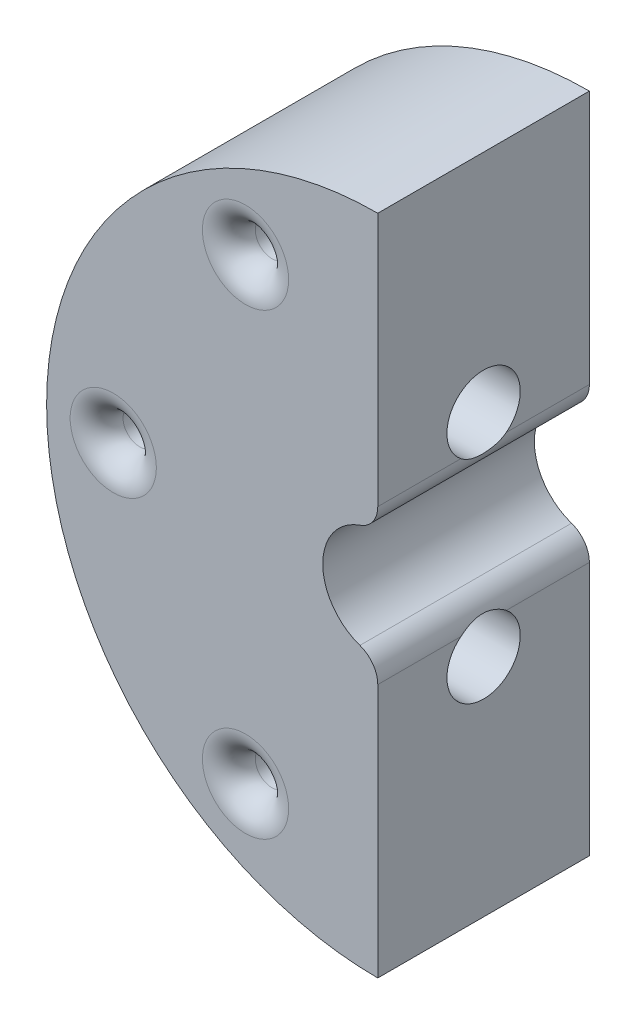
ISO-10303-21;
HEADER;
FILE_DESCRIPTION(('STEP AP214'),'2;1');
FILE_NAME('part.step','',(''),(''),'','','');
FILE_SCHEMA(('AUTOMOTIVE_DESIGN { 1 0 10303 214 1 1 1 1 }'));
ENDSEC;
DATA;
#1=APPLICATION_CONTEXT('core data for automotive mechanical design processes');
#2=APPLICATION_PROTOCOL_DEFINITION('international standard','automotive_design',2000,#1);
#3=PRODUCT_CONTEXT('',#1,'mechanical');
#4=PRODUCT('Part','Part','',(#3));
#5=PRODUCT_RELATED_PRODUCT_CATEGORY('part','',(#4));
#6=PRODUCT_DEFINITION_FORMATION('','',#4);
#7=PRODUCT_DEFINITION_CONTEXT('part definition',#1,'design');
#8=PRODUCT_DEFINITION('design','',#6,#7);
#9=PRODUCT_DEFINITION_SHAPE('','',#8);
#10=(LENGTH_UNIT() NAMED_UNIT(*) SI_UNIT(.MILLI.,.METRE.));
#11=(NAMED_UNIT(*) PLANE_ANGLE_UNIT() SI_UNIT($,.RADIAN.));
#12=(NAMED_UNIT(*) SI_UNIT($,.STERADIAN.) SOLID_ANGLE_UNIT());
#13=UNCERTAINTY_MEASURE_WITH_UNIT(LENGTH_MEASURE(1.E-05),#10,'distance_accuracy_value','');
#14=(GEOMETRIC_REPRESENTATION_CONTEXT(3) GLOBAL_UNCERTAINTY_ASSIGNED_CONTEXT((#13)) GLOBAL_UNIT_ASSIGNED_CONTEXT((#10,
#11,#12)) REPRESENTATION_CONTEXT('',''));
#15=CARTESIAN_POINT('',(0.,0.,0.));
#16=DIRECTION('',(0.,0.,1.));
#17=DIRECTION('',(1.,0.,0.));
#18=AXIS2_PLACEMENT_3D('',#15,#16,#17);
#19=CARTESIAN_POINT('',(-9.9375,-3.175,3.175));
#20=DIRECTION('',(-1.,0.,0.));
#21=DIRECTION('',(0.,0.,1.));
#22=AXIS2_PLACEMENT_3D('',#19,#20,#21);
#23=CYLINDRICAL_SURFACE('',#22,1.09999999999999);
#24=CARTESIAN_POINT('',(0.,-2.31230696491621,2.49253335083837));
#25=CARTESIAN_POINT('',(-7.43143425228286E-06,-2.29126077753582,2.51913015816657));
#26=CARTESIAN_POINT('',(-0.000836799634948,-2.27146642300722,2.5466871381002));
#27=CARTESIAN_POINT('',(-0.00360072336538552,-2.234532826673,2.60345402167609));
#28=CARTESIAN_POINT('',(-0.00553461012645173,-2.21739198618145,2.63266291547702));
#29=CARTESIAN_POINT('',(-0.00997139389684681,-2.18588255184023,2.69251516018293));
#30=CARTESIAN_POINT('',(-0.0124745979786323,-2.17151546182758,2.72315927809512));
#31=CARTESIAN_POINT('',(-0.0175784460793436,-2.14566517443541,2.78562408244303));
#32=CARTESIAN_POINT('',(-0.0201790930291506,-2.13418206388022,2.8174448042682));
#33=CARTESIAN_POINT('',(-0.0269657425191364,-2.10632937406573,2.90744871636319));
#34=CARTESIAN_POINT('',(-0.0307924703226663,-2.09320638503706,2.96670642694179));
#35=CARTESIAN_POINT('',(-0.0356629162408617,-2.07689734168796,3.08655758368131));
#36=CARTESIAN_POINT('',(-0.0367121768132153,-2.07369149547079,3.14714812603052));
#37=CARTESIAN_POINT('',(-0.0355972092486964,-2.07726257113507,3.2676371701562));
#38=CARTESIAN_POINT('',(-0.0334524825756308,-2.08397890933652,3.32753763969379));
#39=CARTESIAN_POINT('',(-0.0269043805902933,-2.10705679332446,3.44539638527011));
#40=CARTESIAN_POINT('',(-0.0224972960626412,-2.12343418534562,3.50335130474348));
#41=CARTESIAN_POINT('',(-0.0136324555166215,-2.1644187613236,3.61317185594627));
#42=CARTESIAN_POINT('',(-0.00918683080751507,-2.18860266281152,3.66519568172682));
#43=CARTESIAN_POINT('',(-0.00407750667684388,-2.2307281225266,3.73995057010211));
#44=CARTESIAN_POINT('',(-0.00263452346544988,-2.245737521952,3.7643127357592));
#45=CARTESIAN_POINT('',(-0.000597073925163878,-2.2776347273822,3.81183206032508));
#46=CARTESIAN_POINT('',(-3.13776855105282E-06,-2.29452369996559,3.8349884576262));
#47=CARTESIAN_POINT('',(0.,-2.31230696491621,3.85746664916162));
#48=B_SPLINE_CURVE_WITH_KNOTS('',3,(#24,#25,#26,#27,#28,#29,#30,#31,#32,#33,#34,#35,#36,#37,#38,
#39,#40,#41,#42,#43,#44,#45,#46,#47),.UNSPECIFIED.,.F.,.F.,(4,2,2,2,2,2,2,2,2,2,2,4),(0.,
0.101669856169745,0.203278217997869,0.304941514807224,0.406607871897994,0.588130945618415,
0.76929151458861,0.949350500524961,1.12970564687131,1.30157847846982,1.38744447467445,
1.47336406498217),.UNSPECIFIED.);
#49=CARTESIAN_POINT('',(0.,-2.31230696491621,2.49253335083837));
#50=VERTEX_POINT('',#49);
#51=CARTESIAN_POINT('',(0.,-2.31230696491621,3.85746664916163));
#52=VERTEX_POINT('',#51);
#53=EDGE_CURVE('E334',#50,#52,#48,.T.);
#54=ORIENTED_EDGE('',*,*,#53,.T.);
#55=CARTESIAN_POINT('',(0.,-3.175,3.175));
#56=DIRECTION('',(-1.,0.,0.));
#57=DIRECTION('',(0.,0.,1.));
#58=AXIS2_PLACEMENT_3D('',#55,#56,#57);
#59=CIRCLE('',#58,1.1);
#60=EDGE_CURVE('E251',#50,#52,#59,.T.);
#61=ORIENTED_EDGE('',*,*,#60,.F.);
#62=EDGE_LOOP('',(#54,#61));
#63=FACE_BOUND('',#62,.T.);
#64=CARTESIAN_POINT('',(-5.175,-3.175,3.175));
#65=DIRECTION('',(-1.,0.,0.));
#66=DIRECTION('',(0.,0.,1.));
#67=AXIS2_PLACEMENT_3D('',#64,#65,#66);
#68=CIRCLE('',#67,1.09999999999999);
#69=CARTESIAN_POINT('',(-5.175,-3.175,4.27499999999999));
#70=VERTEX_POINT('',#69);
#71=EDGE_CURVE('E202',#70,#70,#68,.F.);
#72=ORIENTED_EDGE('',*,*,#71,.F.);
#73=EDGE_LOOP('',(#72));
#74=FACE_BOUND('',#73,.T.);
#75=ADVANCED_FACE('F33',(#63,#74),#23,.F.);
#76=CARTESIAN_POINT('',(-9.9375,3.175,3.175));
#77=DIRECTION('',(-1.,0.,0.));
#78=DIRECTION('',(0.,0.,1.));
#79=AXIS2_PLACEMENT_3D('',#76,#77,#78);
#80=CYLINDRICAL_SURFACE('',#79,1.09999999999999);
#81=CARTESIAN_POINT('',(0.,2.31230696491621,3.85746664916162));
#82=CARTESIAN_POINT('',(-7.43143425224054E-06,2.29126077753582,3.83086984183343));
#83=CARTESIAN_POINT('',(-0.000836799634947949,2.27146642300722,3.80331286189979));
#84=CARTESIAN_POINT('',(-0.00360072336538548,2.234532826673,3.74654597832391));
#85=CARTESIAN_POINT('',(-0.00553461012645171,2.21739198618145,3.71733708452298));
#86=CARTESIAN_POINT('',(-0.00997139389684687,2.18588255184023,3.65748483981707));
#87=CARTESIAN_POINT('',(-0.0124745979786324,2.17151546182758,3.62684072190488));
#88=CARTESIAN_POINT('',(-0.0175784460793438,2.14566517443541,3.56437591755697));
#89=CARTESIAN_POINT('',(-0.0201790930291507,2.13418206388022,3.5325551957318));
#90=CARTESIAN_POINT('',(-0.0269657425191364,2.10632937406573,3.44255128363681));
#91=CARTESIAN_POINT('',(-0.0307924703226663,2.09320638503706,3.38329357305821));
#92=CARTESIAN_POINT('',(-0.0356629162408618,2.07689734168796,3.26344241631869));
#93=CARTESIAN_POINT('',(-0.0367121768132155,2.07369149547079,3.20285187396948));
#94=CARTESIAN_POINT('',(-0.0355972092486968,2.07726257113507,3.0823628298438));
#95=CARTESIAN_POINT('',(-0.0334524825756311,2.08397890933652,3.02246236030621));
#96=CARTESIAN_POINT('',(-0.0269043805902936,2.10705679332446,2.90460361472988));
#97=CARTESIAN_POINT('',(-0.0224972960626416,2.12343418534562,2.84664869525652));
#98=CARTESIAN_POINT('',(-0.0136324555166217,2.1644187613236,2.73682814405373));
#99=CARTESIAN_POINT('',(-0.00918683080751522,2.18860266281152,2.68480431827317));
#100=CARTESIAN_POINT('',(-0.00407750667684388,2.2307281225266,2.61004942989788));
#101=CARTESIAN_POINT('',(-0.00263452346544984,2.245737521952,2.5856872642408));
#102=CARTESIAN_POINT('',(-0.000597073925163832,2.2776347273822,2.53816793967492));
#103=CARTESIAN_POINT('',(-3.13776855103632E-06,2.29452369996559,2.51501154237379));
#104=CARTESIAN_POINT('',(0.,2.31230696491621,2.49253335083837));
#105=B_SPLINE_CURVE_WITH_KNOTS('',3,(#81,#82,#83,#84,#85,#86,#87,#88,#89,#90,#91,#92,#93,#94,
#95,#96,#97,#98,#99,#100,#101,#102,#103,#104),.UNSPECIFIED.,.F.,.F.,(4,2,2,2,2,2,2,2,2,2,2,4),
(0.,0.101669856169745,0.203278217997869,0.304941514807226,0.406607871897994,0.588130945618414,
0.76929151458861,0.949350500524962,1.12970564687131,1.30157847846982,1.38744447467445,
1.47336406498218),.UNSPECIFIED.);
#106=CARTESIAN_POINT('',(0.,2.31230696491621,3.85746664916162));
#107=VERTEX_POINT('',#106);
#108=CARTESIAN_POINT('',(0.,2.31230696491621,2.49253335083836));
#109=VERTEX_POINT('',#108);
#110=EDGE_CURVE('E341',#107,#109,#105,.T.);
#111=ORIENTED_EDGE('',*,*,#110,.T.);
#112=CARTESIAN_POINT('',(0.,3.175,3.175));
#113=DIRECTION('',(-1.,0.,0.));
#114=DIRECTION('',(0.,0.,1.));
#115=AXIS2_PLACEMENT_3D('',#112,#113,#114);
#116=CIRCLE('',#115,1.1);
#117=EDGE_CURVE('E248',#107,#109,#116,.T.);
#118=ORIENTED_EDGE('',*,*,#117,.F.);
#119=EDGE_LOOP('',(#111,#118));
#120=FACE_BOUND('',#119,.T.);
#121=CARTESIAN_POINT('',(-5.175,3.175,3.175));
#122=DIRECTION('',(-1.,0.,0.));
#123=DIRECTION('',(0.,0.,1.));
#124=AXIS2_PLACEMENT_3D('',#121,#122,#123);
#125=CIRCLE('',#124,1.09999999999999);
#126=CARTESIAN_POINT('',(-5.175,3.175,4.27499999999999));
#127=VERTEX_POINT('',#126);
#128=EDGE_CURVE('E234',#127,#127,#125,.F.);
#129=ORIENTED_EDGE('',*,*,#128,.F.);
#130=EDGE_LOOP('',(#129));
#131=FACE_BOUND('',#130,.T.);
#132=ADVANCED_FACE('F354',(#120,#131),#80,.F.);
#133=CARTESIAN_POINT('',(0.,0.,6.35));
#134=DIRECTION('',(0.,0.,1.));
#135=DIRECTION('',(1.,0.,0.));
#136=AXIS2_PLACEMENT_3D('',#133,#134,#135);
#137=PLANE('',#136);
#138=CARTESIAN_POINT('',(-3.96874999999998,6.87407664253899,6.35));
#139=DIRECTION('',(0.,0.,1.));
#140=DIRECTION('',(1.,0.,0.));
#141=AXIS2_PLACEMENT_3D('',#138,#139,#140);
#142=CIRCLE('',#141,1.29375);
#143=CARTESIAN_POINT('',(-2.67499999999998,6.87407664253899,6.35));
#144=VERTEX_POINT('',#143);
#145=EDGE_CURVE('E319',#144,#144,#142,.F.);
#146=ORIENTED_EDGE('',*,*,#145,.T.);
#147=EDGE_LOOP('',(#146));
#148=FACE_BOUND('',#147,.T.);
#149=CARTESIAN_POINT('',(-3.96875,-6.874076642539,6.35));
#150=DIRECTION('',(0.,0.,1.));
#151=DIRECTION('',(1.,0.,0.));
#152=AXIS2_PLACEMENT_3D('',#149,#150,#151);
#153=CIRCLE('',#152,1.29375);
#154=CARTESIAN_POINT('',(-2.675,-6.874076642539,6.35));
#155=VERTEX_POINT('',#154);
#156=EDGE_CURVE('E316',#155,#155,#153,.F.);
#157=ORIENTED_EDGE('',*,*,#156,.T.);
#158=EDGE_LOOP('',(#157));
#159=FACE_BOUND('',#158,.T.);
#160=CARTESIAN_POINT('',(-7.9375,0.,6.35));
#161=DIRECTION('',(0.,0.,1.));
#162=DIRECTION('',(1.,0.,0.));
#163=AXIS2_PLACEMENT_3D('',#160,#161,#162);
#164=CIRCLE('',#163,1.29375);
#165=CARTESIAN_POINT('',(-6.64375,0.,6.35));
#166=VERTEX_POINT('',#165);
#167=EDGE_CURVE('E313',#166,#166,#164,.F.);
#168=ORIENTED_EDGE('',*,*,#167,.T.);
#169=EDGE_LOOP('',(#168));
#170=FACE_BOUND('',#169,.T.);
#171=DIRECTION('',(0.,-1.,0.));
#172=VECTOR('',#171,1.);
#173=CARTESIAN_POINT('',(0.,0.,6.35));
#174=LINE('',#173,#172);
#175=CARTESIAN_POINT('',(0.,-2.31230696491621,6.35));
#176=VERTEX_POINT('',#175);
#177=CARTESIAN_POINT('',(0.,-9.9375,6.35));
#178=VERTEX_POINT('',#177);
#179=EDGE_CURVE('E254',#176,#178,#174,.T.);
#180=ORIENTED_EDGE('',*,*,#179,.F.);
#181=CARTESIAN_POINT('',(-0.79375,-2.31230696491621,6.35));
#182=DIRECTION('',(0.,0.,1.));
#183=DIRECTION('',(1.,0.,0.));
#184=AXIS2_PLACEMENT_3D('',#181,#182,#183);
#185=CIRCLE('',#184,0.79375);
#186=CARTESIAN_POINT('',(-0.536038961038961,-1.56155795033302,6.35));
#187=VERTEX_POINT('',#186);
#188=EDGE_CURVE('E284',#176,#187,#185,.T.);
#189=ORIENTED_EDGE('',*,*,#188,.T.);
#190=CARTESIAN_POINT('',(0.,0.,6.35));
#191=DIRECTION('',(0.,0.,1.));
#192=DIRECTION('',(1.,0.,0.));
#193=AXIS2_PLACEMENT_3D('',#190,#191,#192);
#194=CIRCLE('',#193,1.651);
#195=CARTESIAN_POINT('',(-0.536038961038961,1.56155795033302,6.35));
#196=VERTEX_POINT('',#195);
#197=EDGE_CURVE('E267',#196,#187,#194,.T.);
#198=ORIENTED_EDGE('',*,*,#197,.F.);
#199=CARTESIAN_POINT('',(-0.79375,2.31230696491621,6.35));
#200=DIRECTION('',(0.,0.,1.));
#201=DIRECTION('',(1.,0.,0.));
#202=AXIS2_PLACEMENT_3D('',#199,#200,#201);
#203=CIRCLE('',#202,0.79375);
#204=CARTESIAN_POINT('',(0.,2.31230696491621,6.35));
#205=VERTEX_POINT('',#204);
#206=EDGE_CURVE('E282',#196,#205,#203,.T.);
#207=ORIENTED_EDGE('',*,*,#206,.T.);
#208=CARTESIAN_POINT('',(0.,9.9375,6.35));
#209=VERTEX_POINT('',#208);
#210=EDGE_CURVE('E258',#209,#205,#174,.T.);
#211=ORIENTED_EDGE('',*,*,#210,.F.);
#212=CARTESIAN_POINT('',(0.,0.,6.35));
#213=DIRECTION('',(0.,0.,1.));
#214=DIRECTION('',(1.,0.,0.));
#215=AXIS2_PLACEMENT_3D('',#212,#213,#214);
#216=CIRCLE('',#215,9.9375);
#217=EDGE_CURVE('E273',#209,#178,#216,.T.);
#218=ORIENTED_EDGE('',*,*,#217,.T.);
#219=EDGE_LOOP('',(#180,#189,#198,#207,#211,#218));
#220=FACE_BOUND('',#219,.T.);
#221=ADVANCED_FACE('F380',(#148,#159,#170,#220),#137,.T.);
#222=CARTESIAN_POINT('',(0.,0.,0.));
#223=DIRECTION('',(0.,0.,1.));
#224=DIRECTION('',(1.,0.,0.));
#225=AXIS2_PLACEMENT_3D('',#222,#223,#224);
#226=PLANE('',#225);
#227=CARTESIAN_POINT('',(-3.96874999999998,6.87407664253899,0.));
#228=DIRECTION('',(0.,0.,1.));
#229=DIRECTION('',(1.,0.,0.));
#230=AXIS2_PLACEMENT_3D('',#227,#228,#229);
#231=CIRCLE('',#230,1.29375);
#232=CARTESIAN_POINT('',(-2.67499999999998,6.87407664253899,0.));
#233=VERTEX_POINT('',#232);
#234=EDGE_CURVE('E304',#233,#233,#231,.T.);
#235=ORIENTED_EDGE('',*,*,#234,.T.);
#236=EDGE_LOOP('',(#235));
#237=FACE_BOUND('',#236,.T.);
#238=CARTESIAN_POINT('',(-3.96875,-6.874076642539,0.));
#239=DIRECTION('',(0.,0.,1.));
#240=DIRECTION('',(1.,0.,0.));
#241=AXIS2_PLACEMENT_3D('',#238,#239,#240);
#242=CIRCLE('',#241,1.29375);
#243=CARTESIAN_POINT('',(-2.675,-6.874076642539,0.));
#244=VERTEX_POINT('',#243);
#245=EDGE_CURVE('E301',#244,#244,#242,.T.);
#246=ORIENTED_EDGE('',*,*,#245,.T.);
#247=EDGE_LOOP('',(#246));
#248=FACE_BOUND('',#247,.T.);
#249=CARTESIAN_POINT('',(-7.9375,0.,0.));
#250=DIRECTION('',(0.,0.,1.));
#251=DIRECTION('',(1.,0.,0.));
#252=AXIS2_PLACEMENT_3D('',#249,#250,#251);
#253=CIRCLE('',#252,1.29375);
#254=CARTESIAN_POINT('',(-6.64375,0.,0.));
#255=VERTEX_POINT('',#254);
#256=EDGE_CURVE('E298',#255,#255,#253,.T.);
#257=ORIENTED_EDGE('',*,*,#256,.T.);
#258=EDGE_LOOP('',(#257));
#259=FACE_BOUND('',#258,.T.);
#260=CARTESIAN_POINT('',(0.,0.,0.));
#261=DIRECTION('',(0.,0.,1.));
#262=DIRECTION('',(1.,0.,0.));
#263=AXIS2_PLACEMENT_3D('',#260,#261,#262);
#264=CIRCLE('',#263,1.651);
#265=CARTESIAN_POINT('',(-0.536038961038961,1.56155795033302,0.));
#266=VERTEX_POINT('',#265);
#267=CARTESIAN_POINT('',(-0.536038961038961,-1.56155795033302,0.));
#268=VERTEX_POINT('',#267);
#269=EDGE_CURVE('E266',#266,#268,#264,.T.);
#270=ORIENTED_EDGE('',*,*,#269,.T.);
#271=CARTESIAN_POINT('',(-0.79375,-2.31230696491621,0.));
#272=DIRECTION('',(0.,0.,1.));
#273=DIRECTION('',(1.,0.,0.));
#274=AXIS2_PLACEMENT_3D('',#271,#272,#273);
#275=CIRCLE('',#274,0.79375);
#276=CARTESIAN_POINT('',(0.,-2.31230696491621,0.));
#277=VERTEX_POINT('',#276);
#278=EDGE_CURVE('E292',#268,#277,#275,.F.);
#279=ORIENTED_EDGE('',*,*,#278,.T.);
#280=DIRECTION('',(0.,-1.,0.));
#281=VECTOR('',#280,1.);
#282=CARTESIAN_POINT('',(0.,-25.4,0.));
#283=LINE('',#282,#281);
#284=CARTESIAN_POINT('',(0.,-9.9375,0.));
#285=VERTEX_POINT('',#284);
#286=EDGE_CURVE('E255',#277,#285,#283,.T.);
#287=ORIENTED_EDGE('',*,*,#286,.T.);
#288=CARTESIAN_POINT('',(0.,0.,0.));
#289=DIRECTION('',(0.,0.,1.));
#290=DIRECTION('',(1.,0.,0.));
#291=AXIS2_PLACEMENT_3D('',#288,#289,#290);
#292=CIRCLE('',#291,9.9375);
#293=CARTESIAN_POINT('',(0.,9.9375,0.));
#294=VERTEX_POINT('',#293);
#295=EDGE_CURVE('E270',#294,#285,#292,.T.);
#296=ORIENTED_EDGE('',*,*,#295,.F.);
#297=CARTESIAN_POINT('',(0.,2.31230696491621,0.));
#298=VERTEX_POINT('',#297);
#299=EDGE_CURVE('E257',#294,#298,#283,.T.);
#300=ORIENTED_EDGE('',*,*,#299,.T.);
#301=CARTESIAN_POINT('',(-0.79375,2.31230696491621,0.));
#302=DIRECTION('',(0.,0.,1.));
#303=DIRECTION('',(1.,0.,0.));
#304=AXIS2_PLACEMENT_3D('',#301,#302,#303);
#305=CIRCLE('',#304,0.79375);
#306=EDGE_CURVE('E290',#298,#266,#305,.F.);
#307=ORIENTED_EDGE('',*,*,#306,.T.);
#308=EDGE_LOOP('',(#270,#279,#287,#296,#300,#307));
#309=FACE_BOUND('',#308,.T.);
#310=ADVANCED_FACE('F383',(#237,#248,#259,#309),#226,.F.);
#311=CARTESIAN_POINT('',(0.,0.,6.35));
#312=DIRECTION('',(0.,0.,-1.));
#313=DIRECTION('',(-1.,0.,0.));
#314=AXIS2_PLACEMENT_3D('',#311,#312,#313);
#315=CYLINDRICAL_SURFACE('',#314,9.9375);
#316=CARTESIAN_POINT('',(0.,0.,12.6742613140312));
#317=DIRECTION('',(0.,-0.866025403784438,0.500000000000001));
#318=DIRECTION('',(0.,-0.500000000000001,-0.866025403784438));
#319=AXIS2_PLACEMENT_3D('',#316,#317,#318);
#320=ELLIPSE('',#319,19.875,9.9375);
#321=CARTESIAN_POINT('',(-8.94469672476146,-4.32970053837925,5.17500000000001));
#322=VERTEX_POINT('',#321);
#323=CARTESIAN_POINT('',(-8.28705322049099,-5.48440107675851,3.175));
#324=VERTEX_POINT('',#323);
#325=EDGE_CURVE('E393',#322,#324,#320,.T.);
#326=ORIENTED_EDGE('',*,*,#325,.T.);
#327=CARTESIAN_POINT('',(0.,0.,-6.32426131403119));
#328=DIRECTION('',(0.,-0.866025403784439,-0.5));
#329=DIRECTION('',(0.,0.5,-0.866025403784438));
#330=AXIS2_PLACEMENT_3D('',#327,#328,#329);
#331=ELLIPSE('',#330,19.875,9.9375);
#332=CARTESIAN_POINT('',(-8.94469672476146,-4.32970053837925,1.175));
#333=VERTEX_POINT('',#332);
#334=EDGE_CURVE('E11',#324,#333,#331,.T.);
#335=ORIENTED_EDGE('',*,*,#334,.T.);
#336=CARTESIAN_POINT('',(0.,0.,1.175));
#337=DIRECTION('',(0.,0.,-1.));
#338=DIRECTION('',(0.,1.,0.));
#339=AXIS2_PLACEMENT_3D('',#336,#337,#338);
#340=CIRCLE('',#339,9.9375);
#341=CARTESIAN_POINT('',(-9.7299689791579,-2.02029946162075,1.175));
#342=VERTEX_POINT('',#341);
#343=EDGE_CURVE('E41',#333,#342,#340,.T.);
#344=ORIENTED_EDGE('',*,*,#343,.T.);
#345=CARTESIAN_POINT('',(0.,0.,4.67426131403118));
#346=DIRECTION('',(0.,0.866025403784438,-0.500000000000001));
#347=DIRECTION('',(0.,-0.500000000000001,-0.866025403784438));
#348=AXIS2_PLACEMENT_3D('',#345,#346,#347);
#349=ELLIPSE('',#348,19.875,9.9375);
#350=CARTESIAN_POINT('',(-9.89972952933984,-0.865598923241494,3.175));
#351=VERTEX_POINT('',#350);
#352=EDGE_CURVE('E439',#342,#351,#349,.T.);
#353=ORIENTED_EDGE('',*,*,#352,.T.);
#354=CARTESIAN_POINT('',(0.,0.,1.67573868596881));
#355=DIRECTION('',(0.,0.866025403784439,0.499999999999999));
#356=DIRECTION('',(0.,0.499999999999999,-0.866025403784439));
#357=AXIS2_PLACEMENT_3D('',#354,#355,#356);
#358=ELLIPSE('',#357,19.875,9.9375);
#359=CARTESIAN_POINT('',(-9.72996897915789,-2.02029946162074,5.175));
#360=VERTEX_POINT('',#359);
#361=EDGE_CURVE('E436',#351,#360,#358,.T.);
#362=ORIENTED_EDGE('',*,*,#361,.T.);
#363=CARTESIAN_POINT('',(0.,0.,5.175));
#364=DIRECTION('',(0.,0.,1.));
#365=DIRECTION('',(0.,-1.,0.));
#366=AXIS2_PLACEMENT_3D('',#363,#364,#365);
#367=CIRCLE('',#366,9.9375);
#368=EDGE_CURVE('E434',#360,#322,#367,.T.);
#369=ORIENTED_EDGE('',*,*,#368,.T.);
#370=EDGE_LOOP('',(#326,#335,#344,#353,#362,#369));
#371=FACE_BOUND('',#370,.T.);
#372=CARTESIAN_POINT('',(0.,0.,1.67573868596883));
#373=DIRECTION('',(0.,-0.866025403784438,0.500000000000001));
#374=DIRECTION('',(0.,-0.500000000000001,-0.866025403784438));
#375=AXIS2_PLACEMENT_3D('',#372,#373,#374);
#376=ELLIPSE('',#375,19.875,9.9375);
#377=CARTESIAN_POINT('',(-9.7299689791579,2.02029946162075,5.175));
#378=VERTEX_POINT('',#377);
#379=CARTESIAN_POINT('',(-9.89972952933984,0.865598923241491,3.175));
#380=VERTEX_POINT('',#379);
#381=EDGE_CURVE('E398',#378,#380,#376,.T.);
#382=ORIENTED_EDGE('',*,*,#381,.T.);
#383=CARTESIAN_POINT('',(0.,0.,4.67426131403117));
#384=DIRECTION('',(0.,-0.866025403784439,-0.5));
#385=DIRECTION('',(0.,0.5,-0.866025403784438));
#386=AXIS2_PLACEMENT_3D('',#383,#384,#385);
#387=ELLIPSE('',#386,19.875,9.9375);
#388=CARTESIAN_POINT('',(-9.72996897915789,2.02029946162075,1.175));
#389=VERTEX_POINT('',#388);
#390=EDGE_CURVE('E429',#380,#389,#387,.T.);
#391=ORIENTED_EDGE('',*,*,#390,.T.);
#392=CARTESIAN_POINT('',(0.,0.,1.175));
#393=DIRECTION('',(0.,0.,-1.));
#394=DIRECTION('',(0.,1.,0.));
#395=AXIS2_PLACEMENT_3D('',#392,#393,#394);
#396=CIRCLE('',#395,9.9375);
#397=CARTESIAN_POINT('',(-8.94469672476146,4.32970053837925,1.175));
#398=VERTEX_POINT('',#397);
#399=EDGE_CURVE('E426',#389,#398,#396,.T.);
#400=ORIENTED_EDGE('',*,*,#399,.T.);
#401=CARTESIAN_POINT('',(0.,0.,-6.32426131403118));
#402=DIRECTION('',(0.,0.866025403784438,-0.500000000000001));
#403=DIRECTION('',(0.,-0.500000000000001,-0.866025403784438));
#404=AXIS2_PLACEMENT_3D('',#401,#402,#403);
#405=ELLIPSE('',#404,19.875,9.9375);
#406=CARTESIAN_POINT('',(-8.287053220491,5.48440107675851,3.175));
#407=VERTEX_POINT('',#406);
#408=EDGE_CURVE('E423',#398,#407,#405,.T.);
#409=ORIENTED_EDGE('',*,*,#408,.T.);
#410=CARTESIAN_POINT('',(0.,0.,12.6742613140312));
#411=DIRECTION('',(0.,0.866025403784439,0.499999999999999));
#412=DIRECTION('',(0.,0.499999999999999,-0.866025403784439));
#413=AXIS2_PLACEMENT_3D('',#410,#411,#412);
#414=ELLIPSE('',#413,19.875,9.9375);
#415=CARTESIAN_POINT('',(-8.94469672476146,4.32970053837925,5.175));
#416=VERTEX_POINT('',#415);
#417=EDGE_CURVE('E418',#407,#416,#414,.T.);
#418=ORIENTED_EDGE('',*,*,#417,.T.);
#419=CARTESIAN_POINT('',(0.,0.,5.17500000000001));
#420=DIRECTION('',(0.,0.,1.));
#421=DIRECTION('',(0.,-1.,0.));
#422=AXIS2_PLACEMENT_3D('',#419,#420,#421);
#423=CIRCLE('',#422,9.9375);
#424=EDGE_CURVE('E416',#416,#378,#423,.T.);
#425=ORIENTED_EDGE('',*,*,#424,.T.);
#426=EDGE_LOOP('',(#382,#391,#400,#409,#418,#425));
#427=FACE_BOUND('',#426,.T.);
#428=ORIENTED_EDGE('',*,*,#217,.F.);
#429=DIRECTION('',(0.,0.,-1.));
#430=VECTOR('',#429,1.);
#431=CARTESIAN_POINT('',(0.,9.9375,6.35));
#432=LINE('',#431,#430);
#433=EDGE_CURVE('E263',#209,#294,#432,.T.);
#434=ORIENTED_EDGE('',*,*,#433,.T.);
#435=ORIENTED_EDGE('',*,*,#295,.T.);
#436=DIRECTION('',(0.,0.,-1.));
#437=VECTOR('',#436,1.);
#438=CARTESIAN_POINT('',(0.,-9.9375,6.35));
#439=LINE('',#438,#437);
#440=EDGE_CURVE('E260',#285,#178,#439,.F.);
#441=ORIENTED_EDGE('',*,*,#440,.T.);
#442=EDGE_LOOP('',(#428,#434,#435,#441));
#443=FACE_BOUND('',#442,.T.);
#444=ADVANCED_FACE('F378',(#371,#427,#443),#315,.T.);
#445=CARTESIAN_POINT('',(0.,0.,6.35));
#446=DIRECTION('',(0.,0.,-1.));
#447=DIRECTION('',(-1.,0.,0.));
#448=AXIS2_PLACEMENT_3D('',#445,#446,#447);
#449=CYLINDRICAL_SURFACE('',#448,1.651);
#450=ORIENTED_EDGE('',*,*,#197,.T.);
#451=DIRECTION('',(0.,0.,-1.));
#452=VECTOR('',#451,1.);
#453=CARTESIAN_POINT('',(-0.536038961038961,-1.56155795033302,6.35));
#454=LINE('',#453,#452);
#455=EDGE_CURVE('E288',#187,#268,#454,.T.);
#456=ORIENTED_EDGE('',*,*,#455,.T.);
#457=ORIENTED_EDGE('',*,*,#269,.F.);
#458=DIRECTION('',(0.,0.,-1.));
#459=VECTOR('',#458,1.);
#460=CARTESIAN_POINT('',(-0.536038961038961,1.56155795033302,6.35));
#461=LINE('',#460,#459);
#462=EDGE_CURVE('E286',#266,#196,#461,.F.);
#463=ORIENTED_EDGE('',*,*,#462,.T.);
#464=EDGE_LOOP('',(#450,#456,#457,#463));
#465=FACE_BOUND('',#464,.T.);
#466=ADVANCED_FACE('F374',(#465),#449,.F.);
#467=CARTESIAN_POINT('',(-7.9375,0.,6.35));
#468=DIRECTION('',(0.,0.,-1.));
#469=DIRECTION('',(-1.,0.,0.));
#470=AXIS2_PLACEMENT_3D('',#467,#468,#469);
#471=CYLINDRICAL_SURFACE('',#470,0.500000000000001);
#472=CARTESIAN_POINT('',(-7.9375,0.,0.79375));
#473=DIRECTION('',(0.,0.,1.));
#474=DIRECTION('',(1.,0.,0.));
#475=AXIS2_PLACEMENT_3D('',#472,#473,#474);
#476=CIRCLE('',#475,0.500000000000001);
#477=CARTESIAN_POINT('',(-7.4375,0.,0.79375));
#478=VERTEX_POINT('',#477);
#479=EDGE_CURVE('E331',#478,#478,#476,.F.);
#480=ORIENTED_EDGE('',*,*,#479,.T.);
#481=EDGE_LOOP('',(#480));
#482=FACE_BOUND('',#481,.T.);
#483=CARTESIAN_POINT('',(-7.9375,0.,5.55625));
#484=DIRECTION('',(0.,0.,1.));
#485=DIRECTION('',(1.,0.,0.));
#486=AXIS2_PLACEMENT_3D('',#483,#484,#485);
#487=CIRCLE('',#486,0.500000000000001);
#488=CARTESIAN_POINT('',(-7.4375,0.,5.55625));
#489=VERTEX_POINT('',#488);
#490=EDGE_CURVE('E328',#489,#489,#487,.T.);
#491=ORIENTED_EDGE('',*,*,#490,.T.);
#492=EDGE_LOOP('',(#491));
#493=FACE_BOUND('',#492,.T.);
#494=ADVANCED_FACE('F370',(#482,#493),#471,.F.);
#495=CARTESIAN_POINT('',(-3.96874999999998,6.87407664253899,6.35));
#496=DIRECTION('',(0.,0.,-1.));
#497=DIRECTION('',(-1.,0.,0.));
#498=AXIS2_PLACEMENT_3D('',#495,#496,#497);
#499=CYLINDRICAL_SURFACE('',#498,0.5);
#500=CARTESIAN_POINT('',(-3.96874999999998,6.87407664253899,0.79375));
#501=DIRECTION('',(0.,0.,1.));
#502=DIRECTION('',(1.,0.,0.));
#503=AXIS2_PLACEMENT_3D('',#500,#501,#502);
#504=CIRCLE('',#503,0.5);
#505=CARTESIAN_POINT('',(-3.46874999999998,6.87407664253899,0.79375));
#506=VERTEX_POINT('',#505);
#507=EDGE_CURVE('E310',#506,#506,#504,.F.);
#508=ORIENTED_EDGE('',*,*,#507,.T.);
#509=EDGE_LOOP('',(#508));
#510=FACE_BOUND('',#509,.T.);
#511=CARTESIAN_POINT('',(-3.96874999999998,6.87407664253899,5.55625));
#512=DIRECTION('',(0.,0.,1.));
#513=DIRECTION('',(1.,0.,0.));
#514=AXIS2_PLACEMENT_3D('',#511,#512,#513);
#515=CIRCLE('',#514,0.5);
#516=CARTESIAN_POINT('',(-3.46874999999998,6.87407664253899,5.55625));
#517=VERTEX_POINT('',#516);
#518=EDGE_CURVE('E307',#517,#517,#515,.T.);
#519=ORIENTED_EDGE('',*,*,#518,.T.);
#520=EDGE_LOOP('',(#519));
#521=FACE_BOUND('',#520,.T.);
#522=ADVANCED_FACE('F366',(#510,#521),#499,.F.);
#523=CARTESIAN_POINT('',(-3.96875,-6.874076642539,6.35));
#524=DIRECTION('',(0.,0.,-1.));
#525=DIRECTION('',(-1.,0.,0.));
#526=AXIS2_PLACEMENT_3D('',#523,#524,#525);
#527=CYLINDRICAL_SURFACE('',#526,0.500000000000001);
#528=CARTESIAN_POINT('',(-3.96875,-6.874076642539,0.79375));
#529=DIRECTION('',(0.,0.,1.));
#530=DIRECTION('',(1.,0.,0.));
#531=AXIS2_PLACEMENT_3D('',#528,#529,#530);
#532=CIRCLE('',#531,0.500000000000001);
#533=CARTESIAN_POINT('',(-3.46875,-6.874076642539,0.79375));
#534=VERTEX_POINT('',#533);
#535=EDGE_CURVE('E325',#534,#534,#532,.F.);
#536=ORIENTED_EDGE('',*,*,#535,.T.);
#537=EDGE_LOOP('',(#536));
#538=FACE_BOUND('',#537,.T.);
#539=CARTESIAN_POINT('',(-3.96875,-6.874076642539,5.55625));
#540=DIRECTION('',(0.,0.,1.));
#541=DIRECTION('',(1.,0.,0.));
#542=AXIS2_PLACEMENT_3D('',#539,#540,#541);
#543=CIRCLE('',#542,0.500000000000001);
#544=CARTESIAN_POINT('',(-3.46875,-6.874076642539,5.55625));
#545=VERTEX_POINT('',#544);
#546=EDGE_CURVE('E322',#545,#545,#543,.T.);
#547=ORIENTED_EDGE('',*,*,#546,.T.);
#548=EDGE_LOOP('',(#547));
#549=FACE_BOUND('',#548,.T.);
#550=ADVANCED_FACE('F363',(#538,#549),#527,.F.);
#551=CARTESIAN_POINT('',(0.,0.,0.));
#552=DIRECTION('',(-1.,0.,0.));
#553=DIRECTION('',(0.,0.,1.));
#554=AXIS2_PLACEMENT_3D('',#551,#552,#553);
#555=PLANE('',#554);
#556=DIRECTION('',(0.,0.,1.));
#557=VECTOR('',#556,1.);
#558=CARTESIAN_POINT('',(0.,-2.31230696491621,6.35));
#559=LINE('',#558,#557);
#560=EDGE_CURVE('E279',#277,#50,#559,.T.);
#561=ORIENTED_EDGE('',*,*,#560,.T.);
#562=ORIENTED_EDGE('',*,*,#60,.T.);
#563=EDGE_CURVE('E276',#52,#176,#559,.T.);
#564=ORIENTED_EDGE('',*,*,#563,.T.);
#565=ORIENTED_EDGE('',*,*,#179,.T.);
#566=ORIENTED_EDGE('',*,*,#440,.F.);
#567=ORIENTED_EDGE('',*,*,#286,.F.);
#568=EDGE_LOOP('',(#561,#562,#564,#565,#566,#567));
#569=FACE_BOUND('',#568,.T.);
#570=ADVANCED_FACE('F361',(#569),#555,.F.);
#571=DIRECTION('',(0.,0.,1.));
#572=VECTOR('',#571,1.);
#573=CARTESIAN_POINT('',(0.,2.31230696491621,0.));
#574=LINE('',#573,#572);
#575=EDGE_CURVE('E295',#205,#107,#574,.F.);
#576=ORIENTED_EDGE('',*,*,#575,.T.);
#577=ORIENTED_EDGE('',*,*,#117,.T.);
#578=EDGE_CURVE('E294',#109,#298,#574,.F.);
#579=ORIENTED_EDGE('',*,*,#578,.T.);
#580=ORIENTED_EDGE('',*,*,#299,.F.);
#581=ORIENTED_EDGE('',*,*,#433,.F.);
#582=ORIENTED_EDGE('',*,*,#210,.T.);
#583=EDGE_LOOP('',(#576,#577,#579,#580,#581,#582));
#584=FACE_BOUND('',#583,.T.);
#585=ADVANCED_FACE('F358',(#584),#555,.F.);
#586=CARTESIAN_POINT('',(-0.79375,-2.31230696491621,6.35));
#587=DIRECTION('',(0.,0.,-1.));
#588=DIRECTION('',(-1.,0.,0.));
#589=AXIS2_PLACEMENT_3D('',#586,#587,#588);
#590=CYLINDRICAL_SURFACE('',#589,0.79375);
#591=ORIENTED_EDGE('',*,*,#53,.F.);
#592=ORIENTED_EDGE('',*,*,#560,.F.);
#593=ORIENTED_EDGE('',*,*,#278,.F.);
#594=ORIENTED_EDGE('',*,*,#455,.F.);
#595=ORIENTED_EDGE('',*,*,#188,.F.);
#596=ORIENTED_EDGE('',*,*,#563,.F.);
#597=EDGE_LOOP('',(#591,#592,#593,#594,#595,#596));
#598=FACE_BOUND('',#597,.T.);
#599=ADVANCED_FACE('F348',(#598),#590,.T.);
#600=CARTESIAN_POINT('',(-0.79375,2.31230696491621,6.35));
#601=DIRECTION('',(0.,0.,-1.));
#602=DIRECTION('',(-1.,0.,0.));
#603=AXIS2_PLACEMENT_3D('',#600,#601,#602);
#604=CYLINDRICAL_SURFACE('',#603,0.79375);
#605=ORIENTED_EDGE('',*,*,#110,.F.);
#606=ORIENTED_EDGE('',*,*,#575,.F.);
#607=ORIENTED_EDGE('',*,*,#206,.F.);
#608=ORIENTED_EDGE('',*,*,#462,.F.);
#609=ORIENTED_EDGE('',*,*,#306,.F.);
#610=ORIENTED_EDGE('',*,*,#578,.F.);
#611=EDGE_LOOP('',(#605,#606,#607,#608,#609,#610));
#612=FACE_BOUND('',#611,.T.);
#613=ADVANCED_FACE('F411',(#612),#604,.T.);
#614=CARTESIAN_POINT('',(-3.96874999999998,6.87407664253899,0.79375));
#615=DIRECTION('',(0.,0.,1.));
#616=DIRECTION('',(1.,0.,0.));
#617=AXIS2_PLACEMENT_3D('',#614,#615,#616);
#618=TOROIDAL_SURFACE('',#617,1.29375,0.79375);
#619=ORIENTED_EDGE('',*,*,#507,.F.);
#620=EDGE_LOOP('',(#619));
#621=FACE_BOUND('',#620,.T.);
#622=ORIENTED_EDGE('',*,*,#234,.F.);
#623=EDGE_LOOP('',(#622));
#624=FACE_BOUND('',#623,.T.);
#625=ADVANCED_FACE('F544',(#621,#624),#618,.T.);
#626=CARTESIAN_POINT('',(-3.96874999999998,6.87407664253899,5.55625));
#627=DIRECTION('',(0.,0.,1.));
#628=DIRECTION('',(1.,0.,0.));
#629=AXIS2_PLACEMENT_3D('',#626,#627,#628);
#630=TOROIDAL_SURFACE('',#629,1.29375,0.79375);
#631=ORIENTED_EDGE('',*,*,#145,.F.);
#632=EDGE_LOOP('',(#631));
#633=FACE_BOUND('',#632,.T.);
#634=ORIENTED_EDGE('',*,*,#518,.F.);
#635=EDGE_LOOP('',(#634));
#636=FACE_BOUND('',#635,.T.);
#637=ADVANCED_FACE('F549',(#633,#636),#630,.T.);
#638=CARTESIAN_POINT('',(-3.96875,-6.874076642539,0.79375));
#639=DIRECTION('',(0.,0.,1.));
#640=DIRECTION('',(1.,0.,0.));
#641=AXIS2_PLACEMENT_3D('',#638,#639,#640);
#642=TOROIDAL_SURFACE('',#641,1.29375,0.79375);
#643=ORIENTED_EDGE('',*,*,#535,.F.);
#644=EDGE_LOOP('',(#643));
#645=FACE_BOUND('',#644,.T.);
#646=ORIENTED_EDGE('',*,*,#245,.F.);
#647=EDGE_LOOP('',(#646));
#648=FACE_BOUND('',#647,.T.);
#649=ADVANCED_FACE('F561',(#645,#648),#642,.T.);
#650=CARTESIAN_POINT('',(-3.96875,-6.874076642539,5.55625));
#651=DIRECTION('',(0.,0.,1.));
#652=DIRECTION('',(1.,0.,0.));
#653=AXIS2_PLACEMENT_3D('',#650,#651,#652);
#654=TOROIDAL_SURFACE('',#653,1.29375,0.79375);
#655=ORIENTED_EDGE('',*,*,#156,.F.);
#656=EDGE_LOOP('',(#655));
#657=FACE_BOUND('',#656,.T.);
#658=ORIENTED_EDGE('',*,*,#546,.F.);
#659=EDGE_LOOP('',(#658));
#660=FACE_BOUND('',#659,.T.);
#661=ADVANCED_FACE('F571',(#657,#660),#654,.T.);
#662=CARTESIAN_POINT('',(-7.9375,0.,0.79375));
#663=DIRECTION('',(0.,0.,1.));
#664=DIRECTION('',(1.,0.,0.));
#665=AXIS2_PLACEMENT_3D('',#662,#663,#664);
#666=TOROIDAL_SURFACE('',#665,1.29375,0.79375);
#667=ORIENTED_EDGE('',*,*,#479,.F.);
#668=EDGE_LOOP('',(#667));
#669=FACE_BOUND('',#668,.T.);
#670=ORIENTED_EDGE('',*,*,#256,.F.);
#671=EDGE_LOOP('',(#670));
#672=FACE_BOUND('',#671,.T.);
#673=ADVANCED_FACE('F492',(#669,#672),#666,.T.);
#674=CARTESIAN_POINT('',(-7.9375,0.,5.55625));
#675=DIRECTION('',(0.,0.,1.));
#676=DIRECTION('',(1.,0.,0.));
#677=AXIS2_PLACEMENT_3D('',#674,#675,#676);
#678=TOROIDAL_SURFACE('',#677,1.29375,0.79375);
#679=ORIENTED_EDGE('',*,*,#167,.F.);
#680=EDGE_LOOP('',(#679));
#681=FACE_BOUND('',#680,.T.);
#682=ORIENTED_EDGE('',*,*,#490,.F.);
#683=EDGE_LOOP('',(#682));
#684=FACE_BOUND('',#683,.T.);
#685=ADVANCED_FACE('F35',(#681,#684),#678,.T.);
#686=CARTESIAN_POINT('',(-5.175,2.02029946162075,1.175));
#687=DIRECTION('',(0.,-0.866025403784439,-0.5));
#688=DIRECTION('',(0.,0.5,-0.866025403784438));
#689=AXIS2_PLACEMENT_3D('',#686,#687,#688);
#690=PLANE('',#689);
#691=DIRECTION('',(-1.,0.,0.));
#692=VECTOR('',#691,1.);
#693=CARTESIAN_POINT('',(-5.175,0.865598923241491,3.175));
#694=LINE('',#693,#692);
#695=CARTESIAN_POINT('',(-5.175,0.865598923241491,3.175));
#696=VERTEX_POINT('',#695);
#697=EDGE_CURVE('E56',#696,#380,#694,.T.);
#698=ORIENTED_EDGE('',*,*,#697,.F.);
#699=DIRECTION('',(0.,-0.5,0.866025403784438));
#700=VECTOR('',#699,1.);
#701=CARTESIAN_POINT('',(-5.175,2.02029946162075,1.175));
#702=LINE('',#701,#700);
#703=CARTESIAN_POINT('',(-5.175,2.02029946162075,1.175));
#704=VERTEX_POINT('',#703);
#705=EDGE_CURVE('E213',#704,#696,#702,.T.);
#706=ORIENTED_EDGE('',*,*,#705,.F.);
#707=DIRECTION('',(-1.,0.,0.));
#708=VECTOR('',#707,1.);
#709=CARTESIAN_POINT('',(-5.175,2.02029946162075,1.175));
#710=LINE('',#709,#708);
#711=EDGE_CURVE('E231',#704,#389,#710,.T.);
#712=ORIENTED_EDGE('',*,*,#711,.T.);
#713=ORIENTED_EDGE('',*,*,#390,.F.);
#714=EDGE_LOOP('',(#698,#706,#712,#713));
#715=FACE_BOUND('',#714,.T.);
#716=ADVANCED_FACE('F473',(#715),#690,.F.);
#717=CARTESIAN_POINT('',(-5.175,4.32970053837925,1.175));
#718=DIRECTION('',(0.,0.,-1.));
#719=DIRECTION('',(0.,1.,0.));
#720=AXIS2_PLACEMENT_3D('',#717,#718,#719);
#721=PLANE('',#720);
#722=ORIENTED_EDGE('',*,*,#711,.F.);
#723=DIRECTION('',(0.,-1.,0.));
#724=VECTOR('',#723,1.);
#725=CARTESIAN_POINT('',(-5.175,4.32970053837925,1.175));
#726=LINE('',#725,#724);
#727=CARTESIAN_POINT('',(-5.175,4.32970053837925,1.175));
#728=VERTEX_POINT('',#727);
#729=EDGE_CURVE('E228',#728,#704,#726,.T.);
#730=ORIENTED_EDGE('',*,*,#729,.F.);
#731=DIRECTION('',(-1.,0.,0.));
#732=VECTOR('',#731,1.);
#733=CARTESIAN_POINT('',(-5.175,4.32970053837925,1.175));
#734=LINE('',#733,#732);
#735=EDGE_CURVE('E235',#728,#398,#734,.T.);
#736=ORIENTED_EDGE('',*,*,#735,.T.);
#737=ORIENTED_EDGE('',*,*,#399,.F.);
#738=EDGE_LOOP('',(#722,#730,#736,#737));
#739=FACE_BOUND('',#738,.T.);
#740=ADVANCED_FACE('F469',(#739),#721,.F.);
#741=CARTESIAN_POINT('',(-5.175,5.48440107675851,3.175));
#742=DIRECTION('',(0.,0.866025403784438,-0.500000000000001));
#743=DIRECTION('',(0.,0.500000000000001,0.866025403784438));
#744=AXIS2_PLACEMENT_3D('',#741,#742,#743);
#745=PLANE('',#744);
#746=ORIENTED_EDGE('',*,*,#735,.F.);
#747=DIRECTION('',(0.,-0.5,-0.866025403784438));
#748=VECTOR('',#747,1.);
#749=CARTESIAN_POINT('',(-5.175,5.48440107675851,3.175));
#750=LINE('',#749,#748);
#751=CARTESIAN_POINT('',(-5.175,5.48440107675851,3.175));
#752=VERTEX_POINT('',#751);
#753=EDGE_CURVE('E225',#752,#728,#750,.T.);
#754=ORIENTED_EDGE('',*,*,#753,.F.);
#755=DIRECTION('',(-1.,0.,0.));
#756=VECTOR('',#755,1.);
#757=CARTESIAN_POINT('',(-5.175,5.48440107675851,3.175));
#758=LINE('',#757,#756);
#759=EDGE_CURVE('E238',#752,#407,#758,.T.);
#760=ORIENTED_EDGE('',*,*,#759,.T.);
#761=ORIENTED_EDGE('',*,*,#408,.F.);
#762=EDGE_LOOP('',(#746,#754,#760,#761));
#763=FACE_BOUND('',#762,.T.);
#764=ADVANCED_FACE('F472',(#763),#745,.F.);
#765=CARTESIAN_POINT('',(-5.175,4.32970053837925,5.175));
#766=DIRECTION('',(0.,0.866025403784439,0.499999999999999));
#767=DIRECTION('',(0.,-0.499999999999999,0.866025403784439));
#768=AXIS2_PLACEMENT_3D('',#765,#766,#767);
#769=PLANE('',#768);
#770=ORIENTED_EDGE('',*,*,#759,.F.);
#771=DIRECTION('',(0.,0.499999999999999,-0.866025403784439));
#772=VECTOR('',#771,1.);
#773=CARTESIAN_POINT('',(-5.175,4.32970053837925,5.175));
#774=LINE('',#773,#772);
#775=CARTESIAN_POINT('',(-5.175,4.32970053837925,5.175));
#776=VERTEX_POINT('',#775);
#777=EDGE_CURVE('E222',#776,#752,#774,.T.);
#778=ORIENTED_EDGE('',*,*,#777,.F.);
#779=DIRECTION('',(-1.,0.,0.));
#780=VECTOR('',#779,1.);
#781=CARTESIAN_POINT('',(-5.175,4.32970053837925,5.175));
#782=LINE('',#781,#780);
#783=EDGE_CURVE('E241',#776,#416,#782,.T.);
#784=ORIENTED_EDGE('',*,*,#783,.T.);
#785=ORIENTED_EDGE('',*,*,#417,.F.);
#786=EDGE_LOOP('',(#770,#778,#784,#785));
#787=FACE_BOUND('',#786,.T.);
#788=ADVANCED_FACE('F477',(#787),#769,.F.);
#789=CARTESIAN_POINT('',(-5.175,2.02029946162075,5.175));
#790=DIRECTION('',(0.,0.,1.));
#791=DIRECTION('',(0.,-1.,0.));
#792=AXIS2_PLACEMENT_3D('',#789,#790,#791);
#793=PLANE('',#792);
#794=ORIENTED_EDGE('',*,*,#783,.F.);
#795=DIRECTION('',(0.,1.,0.));
#796=VECTOR('',#795,1.);
#797=CARTESIAN_POINT('',(-5.175,2.02029946162075,5.175));
#798=LINE('',#797,#796);
#799=CARTESIAN_POINT('',(-5.175,2.02029946162075,5.175));
#800=VERTEX_POINT('',#799);
#801=EDGE_CURVE('E219',#800,#776,#798,.T.);
#802=ORIENTED_EDGE('',*,*,#801,.F.);
#803=DIRECTION('',(-1.,0.,0.));
#804=VECTOR('',#803,1.);
#805=CARTESIAN_POINT('',(-5.175,2.02029946162075,5.175));
#806=LINE('',#805,#804);
#807=EDGE_CURVE('E244',#800,#378,#806,.T.);
#808=ORIENTED_EDGE('',*,*,#807,.T.);
#809=ORIENTED_EDGE('',*,*,#424,.F.);
#810=EDGE_LOOP('',(#794,#802,#808,#809));
#811=FACE_BOUND('',#810,.T.);
#812=ADVANCED_FACE('F481',(#811),#793,.F.);
#813=CARTESIAN_POINT('',(-5.175,0.865598923241491,3.175));
#814=DIRECTION('',(0.,-0.866025403784438,0.500000000000001));
#815=DIRECTION('',(0.,-0.500000000000001,-0.866025403784438));
#816=AXIS2_PLACEMENT_3D('',#813,#814,#815);
#817=PLANE('',#816);
#818=ORIENTED_EDGE('',*,*,#807,.F.);
#819=DIRECTION('',(0.,0.5,0.866025403784438));
#820=VECTOR('',#819,1.);
#821=CARTESIAN_POINT('',(-5.175,0.865598923241491,3.175));
#822=LINE('',#821,#820);
#823=EDGE_CURVE('E216',#696,#800,#822,.T.);
#824=ORIENTED_EDGE('',*,*,#823,.F.);
#825=ORIENTED_EDGE('',*,*,#697,.T.);
#826=ORIENTED_EDGE('',*,*,#381,.F.);
#827=EDGE_LOOP('',(#818,#824,#825,#826));
#828=FACE_BOUND('',#827,.T.);
#829=ADVANCED_FACE('F467',(#828),#817,.F.);
#830=CARTESIAN_POINT('',(-5.175,0.865598923241491,3.175));
#831=DIRECTION('',(-1.,0.,0.));
#832=DIRECTION('',(0.,0.,1.));
#833=AXIS2_PLACEMENT_3D('',#830,#831,#832);
#834=PLANE('',#833);
#835=ORIENTED_EDGE('',*,*,#705,.T.);
#836=ORIENTED_EDGE('',*,*,#823,.T.);
#837=ORIENTED_EDGE('',*,*,#801,.T.);
#838=ORIENTED_EDGE('',*,*,#777,.T.);
#839=ORIENTED_EDGE('',*,*,#753,.T.);
#840=ORIENTED_EDGE('',*,*,#729,.T.);
#841=EDGE_LOOP('',(#835,#836,#837,#838,#839,#840));
#842=FACE_BOUND('',#841,.T.);
#843=ORIENTED_EDGE('',*,*,#128,.T.);
#844=EDGE_LOOP('',(#843));
#845=FACE_BOUND('',#844,.T.);
#846=ADVANCED_FACE('F464',(#842,#845),#834,.T.);
#847=CARTESIAN_POINT('',(-5.175,-4.32970053837925,1.175));
#848=DIRECTION('',(0.,-0.866025403784439,-0.5));
#849=DIRECTION('',(0.,0.5,-0.866025403784438));
#850=AXIS2_PLACEMENT_3D('',#847,#848,#849);
#851=PLANE('',#850);
#852=DIRECTION('',(-1.,0.,0.));
#853=VECTOR('',#852,1.);
#854=CARTESIAN_POINT('',(-5.175,-5.48440107675851,3.175));
#855=LINE('',#854,#853);
#856=CARTESIAN_POINT('',(-5.175,-5.48440107675851,3.175));
#857=VERTEX_POINT('',#856);
#858=EDGE_CURVE('E48',#857,#324,#855,.T.);
#859=ORIENTED_EDGE('',*,*,#858,.F.);
#860=DIRECTION('',(0.,-0.5,0.866025403784438));
#861=VECTOR('',#860,1.);
#862=CARTESIAN_POINT('',(-5.175,-4.32970053837925,1.175));
#863=LINE('',#862,#861);
#864=CARTESIAN_POINT('',(-5.175,-4.32970053837925,1.175));
#865=VERTEX_POINT('',#864);
#866=EDGE_CURVE('E172',#865,#857,#863,.T.);
#867=ORIENTED_EDGE('',*,*,#866,.F.);
#868=DIRECTION('',(-1.,0.,0.));
#869=VECTOR('',#868,1.);
#870=CARTESIAN_POINT('',(-5.175,-4.32970053837925,1.175));
#871=LINE('',#870,#869);
#872=EDGE_CURVE('E200',#865,#333,#871,.T.);
#873=ORIENTED_EDGE('',*,*,#872,.T.);
#874=ORIENTED_EDGE('',*,*,#334,.F.);
#875=EDGE_LOOP('',(#859,#867,#873,#874));
#876=FACE_BOUND('',#875,.T.);
#877=ADVANCED_FACE('F169',(#876),#851,.F.);
#878=CARTESIAN_POINT('',(-5.175,-2.02029946162075,1.175));
#879=DIRECTION('',(0.,0.,-1.));
#880=DIRECTION('',(0.,1.,0.));
#881=AXIS2_PLACEMENT_3D('',#878,#879,#880);
#882=PLANE('',#881);
#883=ORIENTED_EDGE('',*,*,#872,.F.);
#884=DIRECTION('',(0.,-1.,0.));
#885=VECTOR('',#884,1.);
#886=CARTESIAN_POINT('',(-5.175,-2.02029946162075,1.175));
#887=LINE('',#886,#885);
#888=CARTESIAN_POINT('',(-5.175,-2.02029946162075,1.175));
#889=VERTEX_POINT('',#888);
#890=EDGE_CURVE('E176',#889,#865,#887,.T.);
#891=ORIENTED_EDGE('',*,*,#890,.F.);
#892=DIRECTION('',(-1.,0.,0.));
#893=VECTOR('',#892,1.);
#894=CARTESIAN_POINT('',(-5.175,-2.02029946162075,1.175));
#895=LINE('',#894,#893);
#896=EDGE_CURVE('E203',#889,#342,#895,.T.);
#897=ORIENTED_EDGE('',*,*,#896,.T.);
#898=ORIENTED_EDGE('',*,*,#343,.F.);
#899=EDGE_LOOP('',(#883,#891,#897,#898));
#900=FACE_BOUND('',#899,.T.);
#901=ADVANCED_FACE('F443',(#900),#882,.F.);
#902=CARTESIAN_POINT('',(-5.175,-0.865598923241494,3.175));
#903=DIRECTION('',(0.,0.866025403784438,-0.500000000000001));
#904=DIRECTION('',(0.,0.500000000000001,0.866025403784438));
#905=AXIS2_PLACEMENT_3D('',#902,#903,#904);
#906=PLANE('',#905);
#907=ORIENTED_EDGE('',*,*,#896,.F.);
#908=DIRECTION('',(0.,-0.5,-0.866025403784438));
#909=VECTOR('',#908,1.);
#910=CARTESIAN_POINT('',(-5.175,-0.865598923241494,3.175));
#911=LINE('',#910,#909);
#912=CARTESIAN_POINT('',(-5.175,-0.865598923241494,3.175));
#913=VERTEX_POINT('',#912);
#914=EDGE_CURVE('E197',#913,#889,#911,.T.);
#915=ORIENTED_EDGE('',*,*,#914,.F.);
#916=DIRECTION('',(-1.,0.,0.));
#917=VECTOR('',#916,1.);
#918=CARTESIAN_POINT('',(-5.175,-0.865598923241494,3.175));
#919=LINE('',#918,#917);
#920=EDGE_CURVE('E206',#913,#351,#919,.T.);
#921=ORIENTED_EDGE('',*,*,#920,.T.);
#922=ORIENTED_EDGE('',*,*,#352,.F.);
#923=EDGE_LOOP('',(#907,#915,#921,#922));
#924=FACE_BOUND('',#923,.T.);
#925=ADVANCED_FACE('F446',(#924),#906,.F.);
#926=CARTESIAN_POINT('',(-5.175,-2.02029946162075,5.175));
#927=DIRECTION('',(0.,0.866025403784439,0.499999999999999));
#928=DIRECTION('',(0.,-0.499999999999999,0.866025403784439));
#929=AXIS2_PLACEMENT_3D('',#926,#927,#928);
#930=PLANE('',#929);
#931=ORIENTED_EDGE('',*,*,#920,.F.);
#932=DIRECTION('',(0.,0.499999999999999,-0.866025403784439));
#933=VECTOR('',#932,1.);
#934=CARTESIAN_POINT('',(-5.175,-2.02029946162075,5.175));
#935=LINE('',#934,#933);
#936=CARTESIAN_POINT('',(-5.175,-2.02029946162075,5.175));
#937=VERTEX_POINT('',#936);
#938=EDGE_CURVE('E194',#937,#913,#935,.T.);
#939=ORIENTED_EDGE('',*,*,#938,.F.);
#940=DIRECTION('',(-1.,0.,0.));
#941=VECTOR('',#940,1.);
#942=CARTESIAN_POINT('',(-5.175,-2.02029946162075,5.175));
#943=LINE('',#942,#941);
#944=EDGE_CURVE('E209',#937,#360,#943,.T.);
#945=ORIENTED_EDGE('',*,*,#944,.T.);
#946=ORIENTED_EDGE('',*,*,#361,.F.);
#947=EDGE_LOOP('',(#931,#939,#945,#946));
#948=FACE_BOUND('',#947,.T.);
#949=ADVANCED_FACE('F449',(#948),#930,.F.);
#950=CARTESIAN_POINT('',(-5.175,-4.32970053837925,5.17500000000001));
#951=DIRECTION('',(0.,0.,1.));
#952=DIRECTION('',(0.,-1.,0.));
#953=AXIS2_PLACEMENT_3D('',#950,#951,#952);
#954=PLANE('',#953);
#955=ORIENTED_EDGE('',*,*,#944,.F.);
#956=DIRECTION('',(0.,1.,0.));
#957=VECTOR('',#956,1.);
#958=CARTESIAN_POINT('',(-5.175,-4.32970053837925,5.17500000000001));
#959=LINE('',#958,#957);
#960=CARTESIAN_POINT('',(-5.175,-4.32970053837925,5.17500000000001));
#961=VERTEX_POINT('',#960);
#962=EDGE_CURVE('E185',#961,#937,#959,.T.);
#963=ORIENTED_EDGE('',*,*,#962,.F.);
#964=DIRECTION('',(-1.,0.,0.));
#965=VECTOR('',#964,1.);
#966=CARTESIAN_POINT('',(-5.175,-4.32970053837925,5.17500000000001));
#967=LINE('',#966,#965);
#968=EDGE_CURVE('E175',#961,#322,#967,.T.);
#969=ORIENTED_EDGE('',*,*,#968,.T.);
#970=ORIENTED_EDGE('',*,*,#368,.F.);
#971=EDGE_LOOP('',(#955,#963,#969,#970));
#972=FACE_BOUND('',#971,.T.);
#973=ADVANCED_FACE('F451',(#972),#954,.F.);
#974=CARTESIAN_POINT('',(-5.175,-5.48440107675851,3.175));
#975=DIRECTION('',(0.,-0.866025403784438,0.500000000000001));
#976=DIRECTION('',(0.,-0.500000000000001,-0.866025403784438));
#977=AXIS2_PLACEMENT_3D('',#974,#975,#976);
#978=PLANE('',#977);
#979=ORIENTED_EDGE('',*,*,#968,.F.);
#980=DIRECTION('',(0.,0.5,0.866025403784438));
#981=VECTOR('',#980,1.);
#982=CARTESIAN_POINT('',(-5.175,-5.48440107675851,3.175));
#983=LINE('',#982,#981);
#984=EDGE_CURVE('E179',#857,#961,#983,.T.);
#985=ORIENTED_EDGE('',*,*,#984,.F.);
#986=ORIENTED_EDGE('',*,*,#858,.T.);
#987=ORIENTED_EDGE('',*,*,#325,.F.);
#988=EDGE_LOOP('',(#979,#985,#986,#987));
#989=FACE_BOUND('',#988,.T.);
#990=ADVANCED_FACE('F180',(#989),#978,.F.);
#991=CARTESIAN_POINT('',(-5.175,-5.48440107675851,3.175));
#992=DIRECTION('',(-1.,0.,0.));
#993=DIRECTION('',(0.,0.,1.));
#994=AXIS2_PLACEMENT_3D('',#991,#992,#993);
#995=PLANE('',#994);
#996=ORIENTED_EDGE('',*,*,#866,.T.);
#997=ORIENTED_EDGE('',*,*,#984,.T.);
#998=ORIENTED_EDGE('',*,*,#962,.T.);
#999=ORIENTED_EDGE('',*,*,#938,.T.);
#1000=ORIENTED_EDGE('',*,*,#914,.T.);
#1001=ORIENTED_EDGE('',*,*,#890,.T.);
#1002=EDGE_LOOP('',(#996,#997,#998,#999,#1000,#1001));
#1003=FACE_BOUND('',#1002,.T.);
#1004=ORIENTED_EDGE('',*,*,#71,.T.);
#1005=EDGE_LOOP('',(#1004));
#1006=FACE_BOUND('',#1005,.T.);
#1007=ADVANCED_FACE('F187',(#1003,#1006),#995,.T.);
#1008=CLOSED_SHELL('',(#75,#132,#221,#310,#444,#466,#494,#522,#550,#570,#585,#599,#613,#625,
#637,#649,#661,#673,#685,#716,#740,#764,#788,#812,#829,#846,#877,#901,#925,#949,#973,#990,#1007));
#1009=MANIFOLD_SOLID_BREP('B2',#1008);
#1010=ADVANCED_BREP_SHAPE_REPRESENTATION('',(#18,#1009),#14);
#1011=SHAPE_DEFINITION_REPRESENTATION(#9,#1010);
ENDSEC;
END-ISO-10303-21;
